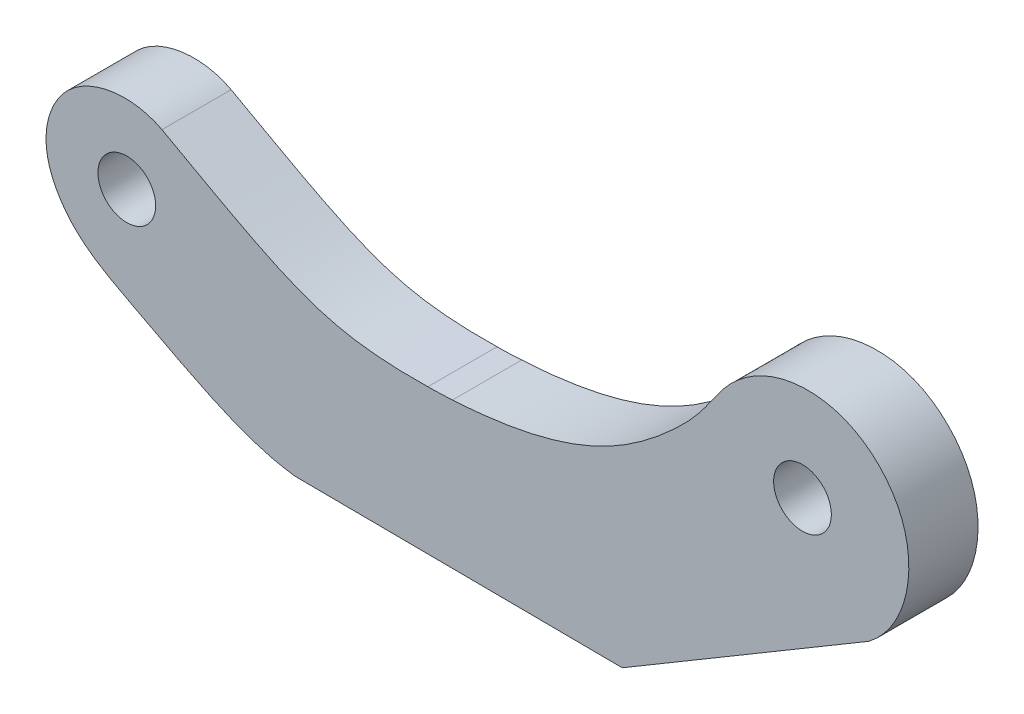
ISO-10303-21;
HEADER;
FILE_DESCRIPTION(('STEP AP214'),'2;1');
FILE_NAME('part.step','',(''),(''),'','','');
FILE_SCHEMA(('AUTOMOTIVE_DESIGN { 1 0 10303 214 1 1 1 1 }'));
ENDSEC;
DATA;
#1=APPLICATION_CONTEXT('core data for automotive mechanical design processes');
#2=APPLICATION_PROTOCOL_DEFINITION('international standard','automotive_design',2000,#1);
#3=PRODUCT_CONTEXT('',#1,'mechanical');
#4=PRODUCT('Part','Part','',(#3));
#5=PRODUCT_RELATED_PRODUCT_CATEGORY('part','',(#4));
#6=PRODUCT_DEFINITION_FORMATION('','',#4);
#7=PRODUCT_DEFINITION_CONTEXT('part definition',#1,'design');
#8=PRODUCT_DEFINITION('design','',#6,#7);
#9=PRODUCT_DEFINITION_SHAPE('','',#8);
#10=(LENGTH_UNIT() NAMED_UNIT(*) SI_UNIT(.MILLI.,.METRE.));
#11=(NAMED_UNIT(*) PLANE_ANGLE_UNIT() SI_UNIT($,.RADIAN.));
#12=(NAMED_UNIT(*) SI_UNIT($,.STERADIAN.) SOLID_ANGLE_UNIT());
#13=UNCERTAINTY_MEASURE_WITH_UNIT(LENGTH_MEASURE(1.E-05),#10,'distance_accuracy_value','');
#14=(GEOMETRIC_REPRESENTATION_CONTEXT(3) GLOBAL_UNCERTAINTY_ASSIGNED_CONTEXT((#13)) GLOBAL_UNIT_ASSIGNED_CONTEXT((#10,
#11,#12)) REPRESENTATION_CONTEXT('',''));
#15=CARTESIAN_POINT('',(0.,0.,0.));
#16=DIRECTION('',(0.,0.,1.));
#17=DIRECTION('',(1.,0.,0.));
#18=AXIS2_PLACEMENT_3D('',#15,#16,#17);
#19=CARTESIAN_POINT('',(-31.2793439312161,18.7531255848201,9.127));
#20=CARTESIAN_POINT('',(-29.0980433454653,20.4036510575763,9.127));
#21=CARTESIAN_POINT('',(-27.9050572559335,25.4416248334502,9.127));
#22=CARTESIAN_POINT('',(-32.3003840528742,29.8584116303143,9.127));
#23=CARTESIAN_POINT('',(-36.6905416729498,29.9188634459079,9.127));
#24=CARTESIAN_POINT('',(-39.6148928825368,27.9423766019697,9.127));
#25=CARTESIAN_POINT('',(-41.0324515703013,25.5521004310688,9.127));
#26=CARTESIAN_POINT('',(-43.2846404569285,23.2416386731387,9.127));
#27=CARTESIAN_POINT('',(-48.1487855967706,19.5714869035757,9.127));
#28=CARTESIAN_POINT('',(-55.4824330057747,18.5532288557096,9.127));
#29=CARTESIAN_POINT('',(-63.127762505071,18.8959739607833,9.127));
#30=CARTESIAN_POINT('',(-68.3011033102577,21.4574379799719,9.127));
#31=CARTESIAN_POINT('',(-72.9856177094147,24.0865685804208,9.127));
#32=CARTESIAN_POINT('',(-76.315266746424,25.8751284241934,9.127));
#33=CARTESIAN_POINT('',(-79.7395264028921,26.2367159767452,9.127));
#34=CARTESIAN_POINT('',(-83.2789287024221,25.7950018133173,9.127));
#35=CARTESIAN_POINT('',(-88.2388176781267,25.8484338999151,9.127));
#36=CARTESIAN_POINT('',(-91.6891719871941,24.9989539466543,9.127));
#37=CARTESIAN_POINT('',(-93.08374484262,23.8512105054544,9.127));
#38=B_SPLINE_CURVE_WITH_KNOTS('',3,(#19,#20,#21,#22,#23,#24,#25,#26,#27,#28,#29,#30,#31,#32,#33,
#34,#35,#36,#37),.UNSPECIFIED.,.F.,.F.,(4,1,1,1,1,1,1,1,1,1,1,1,1,1,1,1,4),(0.,
0.102244465290879,0.160154236261766,0.214292787390952,0.256272844332401,0.289149591331498,
0.319658417070902,0.379342085765607,0.518902230963491,0.590344576338759,0.669858141824343,
0.735080639407954,0.798411315906265,0.81036301693689,0.866325433613108,0.934003558728996,1.),.UNSPECIFIED.);
#39=DIRECTION('',(0.,0.,-1.));
#40=VECTOR('',#39,1.);
#41=SURFACE_OF_LINEAR_EXTRUSION('',#38,#40);
#42=CARTESIAN_POINT('',(-31.2793439312161,18.7531255848201,5.05));
#43=CARTESIAN_POINT('',(-29.0980433454653,20.4036510575763,5.05));
#44=CARTESIAN_POINT('',(-27.9050572559335,25.4416248334502,5.05));
#45=CARTESIAN_POINT('',(-32.3003840528742,29.8584116303143,5.05));
#46=CARTESIAN_POINT('',(-36.6905416729498,29.9188634459079,5.05));
#47=CARTESIAN_POINT('',(-39.6148928825368,27.9423766019697,5.05));
#48=CARTESIAN_POINT('',(-41.0324515703013,25.5521004310688,5.05));
#49=CARTESIAN_POINT('',(-43.2846404569285,23.2416386731387,5.05));
#50=CARTESIAN_POINT('',(-48.1487855967706,19.5714869035757,5.05));
#51=CARTESIAN_POINT('',(-55.4824330057747,18.5532288557096,5.05));
#52=CARTESIAN_POINT('',(-63.127762505071,18.8959739607833,5.05));
#53=CARTESIAN_POINT('',(-68.3011033102577,21.4574379799719,5.05));
#54=CARTESIAN_POINT('',(-72.9856177094147,24.0865685804208,5.05));
#55=CARTESIAN_POINT('',(-76.315266746424,25.8751284241934,5.05));
#56=CARTESIAN_POINT('',(-79.7395264028921,26.2367159767452,5.05));
#57=CARTESIAN_POINT('',(-83.2789287024221,25.7950018133173,5.05));
#58=CARTESIAN_POINT('',(-88.2388176781267,25.8484338999151,5.05));
#59=CARTESIAN_POINT('',(-91.6891719871941,24.9989539466543,5.05));
#60=CARTESIAN_POINT('',(-93.08374484262,23.8512105054544,5.05));
#61=B_SPLINE_CURVE_WITH_KNOTS('',3,(#42,#43,#44,#45,#46,#47,#48,#49,#50,#51,#52,#53,#54,#55,#56,
#57,#58,#59,#60),.UNSPECIFIED.,.F.,.F.,(4,1,1,1,1,1,1,1,1,1,1,1,1,1,1,1,4),(0.,
0.102244465290879,0.160154236261766,0.214292787390952,0.256272844332401,0.289149591331498,
0.319658417070902,0.379342085765607,0.518902230963491,0.590344576338759,0.669858141824343,
0.735080639407954,0.798411315906265,0.81036301693689,0.866325433613108,0.934003558728996,1.),.UNSPECIFIED.);
#62=CARTESIAN_POINT('',(-57.2562652498554,18.7531255848201,5.05));
#63=VERTEX_POINT('',#62);
#64=CARTESIAN_POINT('',(-72.9234112099464,24.0345240039978,5.05));
#65=VERTEX_POINT('',#64);
#66=EDGE_CURVE('E183',#63,#65,#61,.T.);
#67=ORIENTED_EDGE('',*,*,#66,.T.);
#68=DIRECTION('',(0.,0.,-1.));
#69=VECTOR('',#68,1.);
#70=CARTESIAN_POINT('',(-72.9234112099464,24.0345240039978,9.127));
#71=LINE('',#70,#69);
#72=CARTESIAN_POINT('',(-72.9234112099464,24.0345240039978,9.127));
#73=VERTEX_POINT('',#72);
#74=EDGE_CURVE('E11',#73,#65,#71,.T.);
#75=ORIENTED_EDGE('',*,*,#74,.F.);
#76=CARTESIAN_POINT('',(-57.2562652498554,18.7531255848201,9.127));
#77=VERTEX_POINT('',#76);
#78=EDGE_CURVE('E149',#77,#73,#38,.T.);
#79=ORIENTED_EDGE('',*,*,#78,.F.);
#80=DIRECTION('',(0.,0.,-1.));
#81=VECTOR('',#80,1.);
#82=CARTESIAN_POINT('',(-57.2562652498554,18.7531255848201,9.127));
#83=LINE('',#82,#81);
#84=EDGE_CURVE('E117',#77,#63,#83,.T.);
#85=ORIENTED_EDGE('',*,*,#84,.T.);
#86=EDGE_LOOP('',(#67,#75,#79,#85));
#87=FACE_BOUND('',#86,.T.);
#88=ADVANCED_FACE('F36',(#87),#41,.F.);
#89=CARTESIAN_POINT('',(-72.9234110343815,24.0345239075337,9.127));
#90=CARTESIAN_POINT('',(-74.6668385912059,24.9728144011701,9.127));
#91=CARTESIAN_POINT('',(-78.608984564951,24.4332806081771,9.127));
#92=CARTESIAN_POINT('',(-80.3224636066063,19.6609766632408,9.127));
#93=CARTESIAN_POINT('',(-78.2651009405542,16.1277510931857,9.127));
#94=CARTESIAN_POINT('',(-74.7804766187285,14.2670512208381,9.127));
#95=CARTESIAN_POINT('',(-70.5898142586119,12.0499125765865,9.127));
#96=CARTESIAN_POINT('',(-67.2998226179317,10.5540682535027,9.127));
#97=CARTESIAN_POINT('',(-65.0881572359092,10.2736801198191,9.127));
#98=B_SPLINE_CURVE_WITH_KNOTS('',3,(#89,#90,#91,#92,#93,#94,#95,#96,#97),.UNSPECIFIED.,.F.,.F.,
(4,1,1,1,1,1,4),(0.,0.216025249358455,0.338628165965648,0.486312744010124,0.611906589009497,
0.76310073112817,1.),.UNSPECIFIED.);
#99=DIRECTION('',(0.,0.,-1.));
#100=VECTOR('',#99,1.);
#101=SURFACE_OF_LINEAR_EXTRUSION('',#98,#100);
#102=CARTESIAN_POINT('',(-72.9234110343815,24.0345239075337,5.05));
#103=CARTESIAN_POINT('',(-74.6668385912059,24.9728144011701,5.05));
#104=CARTESIAN_POINT('',(-78.608984564951,24.4332806081771,5.05));
#105=CARTESIAN_POINT('',(-80.3224636066063,19.6609766632408,5.05));
#106=CARTESIAN_POINT('',(-78.2651009405542,16.1277510931857,5.05));
#107=CARTESIAN_POINT('',(-74.7804766187285,14.2670512208381,5.05));
#108=CARTESIAN_POINT('',(-70.5898142586119,12.0499125765865,5.05));
#109=CARTESIAN_POINT('',(-67.2998226179317,10.5540682535027,5.05));
#110=CARTESIAN_POINT('',(-65.0881572359092,10.2736801198191,5.05));
#111=B_SPLINE_CURVE_WITH_KNOTS('',3,(#102,#103,#104,#105,#106,#107,#108,#109,#110),
.UNSPECIFIED.,.F.,.F.,(4,1,1,1,1,1,4),(0.,0.216025249358455,0.338628165965648,0.486312744010124,
0.611906589009497,0.76310073112817,1.),.UNSPECIFIED.);
#112=CARTESIAN_POINT('',(-65.0881572359092,10.2736801198191,5.05));
#113=VERTEX_POINT('',#112);
#114=EDGE_CURVE('E181',#65,#113,#111,.T.);
#115=ORIENTED_EDGE('',*,*,#114,.T.);
#116=DIRECTION('',(0.,0.,-1.));
#117=VECTOR('',#116,1.);
#118=CARTESIAN_POINT('',(-65.0881572359092,10.2736801198191,9.127));
#119=LINE('',#118,#117);
#120=CARTESIAN_POINT('',(-65.0881572359092,10.2736801198191,9.127));
#121=VERTEX_POINT('',#120);
#122=EDGE_CURVE('E45',#121,#113,#119,.T.);
#123=ORIENTED_EDGE('',*,*,#122,.F.);
#124=EDGE_CURVE('E90',#73,#121,#98,.T.);
#125=ORIENTED_EDGE('',*,*,#124,.F.);
#126=ORIENTED_EDGE('',*,*,#74,.T.);
#127=EDGE_LOOP('',(#115,#123,#125,#126));
#128=FACE_BOUND('',#127,.T.);
#129=ADVANCED_FACE('F140',(#128),#101,.F.);
#130=CARTESIAN_POINT('',(0.0688111996184571,9.81696790426816,9.127));
#131=DIRECTION('',(0.00700924256241139,0.99997543495763,0.));
#132=DIRECTION('',(-0.99997543495763,0.00700924256241139,0.));
#133=AXIS2_PLACEMENT_3D('',#130,#131,#132);
#134=PLANE('',#133);
#135=DIRECTION('',(0.99997543495763,-0.00700924256241139,0.));
#136=VECTOR('',#135,1.);
#137=CARTESIAN_POINT('',(0.0688111996184571,9.81696790426816,5.05));
#138=LINE('',#137,#136);
#139=CARTESIAN_POINT('',(-45.8065173750898,10.1385271089941,5.05));
#140=VERTEX_POINT('',#139);
#141=EDGE_CURVE('E177',#113,#140,#138,.T.);
#142=ORIENTED_EDGE('',*,*,#141,.T.);
#143=DIRECTION('',(0.,0.,-1.));
#144=VECTOR('',#143,1.);
#145=CARTESIAN_POINT('',(-45.8065173750898,10.1385271089941,9.127));
#146=LINE('',#145,#144);
#147=CARTESIAN_POINT('',(-45.8065173750898,10.1385271089941,9.127));
#148=VERTEX_POINT('',#147);
#149=EDGE_CURVE('E112',#148,#140,#146,.T.);
#150=ORIENTED_EDGE('',*,*,#149,.F.);
#151=DIRECTION('',(0.99997543495763,-0.00700924256241139,0.));
#152=VECTOR('',#151,1.);
#153=CARTESIAN_POINT('',(0.0688111996184571,9.81696790426816,9.127));
#154=LINE('',#153,#152);
#155=EDGE_CURVE('E103',#121,#148,#154,.T.);
#156=ORIENTED_EDGE('',*,*,#155,.F.);
#157=ORIENTED_EDGE('',*,*,#122,.T.);
#158=EDGE_LOOP('',(#142,#150,#156,#157));
#159=FACE_BOUND('',#158,.T.);
#160=ADVANCED_FACE('F137',(#159),#134,.F.);
#161=CARTESIAN_POINT('',(-16.3651324524654,27.597237205665,9.127));
#162=DIRECTION('',(-0.510061044769221,0.860138204365398,0.));
#163=DIRECTION('',(-0.860138204365398,-0.510061044769221,0.));
#164=AXIS2_PLACEMENT_3D('',#161,#162,#163);
#165=PLANE('',#164);
#166=DIRECTION('',(0.860138204365398,0.510061044769221,0.));
#167=VECTOR('',#166,1.);
#168=CARTESIAN_POINT('',(-16.3651324524654,27.597237205665,5.05));
#169=LINE('',#168,#167);
#170=CARTESIAN_POINT('',(-31.2793439312161,18.7531255848201,5.05));
#171=VERTEX_POINT('',#170);
#172=EDGE_CURVE('E111',#140,#171,#169,.T.);
#173=ORIENTED_EDGE('',*,*,#172,.T.);
#174=DIRECTION('',(0.,0.,-1.));
#175=VECTOR('',#174,1.);
#176=CARTESIAN_POINT('',(-31.2793439312161,18.7531255848201,9.127));
#177=LINE('',#176,#175);
#178=CARTESIAN_POINT('',(-31.2793439312161,18.7531255848201,9.127));
#179=VERTEX_POINT('',#178);
#180=EDGE_CURVE('E108',#179,#171,#177,.T.);
#181=ORIENTED_EDGE('',*,*,#180,.F.);
#182=DIRECTION('',(0.860138204365398,0.510061044769221,0.));
#183=VECTOR('',#182,1.);
#184=CARTESIAN_POINT('',(-16.3651324524654,27.597237205665,9.127));
#185=LINE('',#184,#183);
#186=EDGE_CURVE('E97',#148,#179,#185,.T.);
#187=ORIENTED_EDGE('',*,*,#186,.F.);
#188=ORIENTED_EDGE('',*,*,#149,.T.);
#189=EDGE_LOOP('',(#173,#181,#187,#188));
#190=FACE_BOUND('',#189,.T.);
#191=ADVANCED_FACE('F109',(#190),#165,.F.);
#192=CARTESIAN_POINT('',(-31.2793439312161,18.7531255848201,9.127));
#193=CARTESIAN_POINT('',(-29.0980433454653,20.4036510575763,9.127));
#194=CARTESIAN_POINT('',(-27.9050572559335,25.4416248334502,9.127));
#195=CARTESIAN_POINT('',(-32.3003840528742,29.8584116303143,9.127));
#196=CARTESIAN_POINT('',(-36.6905416729498,29.9188634459079,9.127));
#197=CARTESIAN_POINT('',(-39.6148928825368,27.9423766019697,9.127));
#198=CARTESIAN_POINT('',(-41.0324515703013,25.5521004310688,9.127));
#199=CARTESIAN_POINT('',(-43.2846404569285,23.2416386731387,9.127));
#200=CARTESIAN_POINT('',(-48.1487855967706,19.5714869035757,9.127));
#201=CARTESIAN_POINT('',(-55.4824330057747,18.5532288557096,9.127));
#202=CARTESIAN_POINT('',(-63.127762505071,18.8959739607833,9.127));
#203=CARTESIAN_POINT('',(-68.3011033102577,21.4574379799719,9.127));
#204=CARTESIAN_POINT('',(-72.9856177094147,24.0865685804208,9.127));
#205=CARTESIAN_POINT('',(-76.315266746424,25.8751284241934,9.127));
#206=CARTESIAN_POINT('',(-79.7395264028921,26.2367159767452,9.127));
#207=CARTESIAN_POINT('',(-83.2789287024221,25.7950018133173,9.127));
#208=CARTESIAN_POINT('',(-88.2388176781267,25.8484338999151,9.127));
#209=CARTESIAN_POINT('',(-91.6891719871941,24.9989539466543,9.127));
#210=CARTESIAN_POINT('',(-93.08374484262,23.8512105054544,9.127));
#211=B_SPLINE_CURVE_WITH_KNOTS('',3,(#192,#193,#194,#195,#196,#197,#198,#199,#200,#201,#202,
#203,#204,#205,#206,#207,#208,#209,#210),.UNSPECIFIED.,.F.,.F.,(4,1,1,1,1,1,1,1,1,1,1,1,1,1,1,1,
4),(0.,0.102244465290879,0.160154236261766,0.214292787390952,0.256272844332401,
0.289149591331498,0.319658417070902,0.379342085765607,0.518902230963491,0.590344576338759,
0.669858141824343,0.735080639407954,0.798411315906265,0.81036301693689,0.866325433613108,
0.934003558728996,1.),.UNSPECIFIED.);
#212=DIRECTION('',(0.,0.,-1.));
#213=VECTOR('',#212,1.);
#214=SURFACE_OF_LINEAR_EXTRUSION('',#211,#213);
#215=CARTESIAN_POINT('',(-31.2793439312161,18.7531255848201,5.05));
#216=CARTESIAN_POINT('',(-29.0980433454653,20.4036510575763,5.05));
#217=CARTESIAN_POINT('',(-27.9050572559335,25.4416248334502,5.05));
#218=CARTESIAN_POINT('',(-32.3003840528742,29.8584116303143,5.05));
#219=CARTESIAN_POINT('',(-36.6905416729498,29.9188634459079,5.05));
#220=CARTESIAN_POINT('',(-39.6148928825368,27.9423766019697,5.05));
#221=CARTESIAN_POINT('',(-41.0324515703013,25.5521004310688,5.05));
#222=CARTESIAN_POINT('',(-43.2846404569285,23.2416386731387,5.05));
#223=CARTESIAN_POINT('',(-48.1487855967706,19.5714869035757,5.05));
#224=CARTESIAN_POINT('',(-55.4824330057747,18.5532288557096,5.05));
#225=CARTESIAN_POINT('',(-63.127762505071,18.8959739607833,5.05));
#226=CARTESIAN_POINT('',(-68.3011033102577,21.4574379799719,5.05));
#227=CARTESIAN_POINT('',(-72.9856177094147,24.0865685804208,5.05));
#228=CARTESIAN_POINT('',(-76.315266746424,25.8751284241934,5.05));
#229=CARTESIAN_POINT('',(-79.7395264028921,26.2367159767452,5.05));
#230=CARTESIAN_POINT('',(-83.2789287024221,25.7950018133173,5.05));
#231=CARTESIAN_POINT('',(-88.2388176781267,25.8484338999151,5.05));
#232=CARTESIAN_POINT('',(-91.6891719871941,24.9989539466543,5.05));
#233=CARTESIAN_POINT('',(-93.08374484262,23.8512105054544,5.05));
#234=B_SPLINE_CURVE_WITH_KNOTS('',3,(#215,#216,#217,#218,#219,#220,#221,#222,#223,#224,#225,
#226,#227,#228,#229,#230,#231,#232,#233),.UNSPECIFIED.,.F.,.F.,(4,1,1,1,1,1,1,1,1,1,1,1,1,1,1,1,
4),(0.,0.102244465290879,0.160154236261766,0.214292787390952,0.256272844332401,
0.289149591331498,0.319658417070902,0.379342085765607,0.518902230963491,0.590344576338759,
0.669858141824343,0.735080639407954,0.798411315906265,0.81036301693689,0.866325433613108,
0.934003558728996,1.),.UNSPECIFIED.);
#235=CARTESIAN_POINT('',(-55.8031549754556,18.8049533000138,5.05));
#236=VERTEX_POINT('',#235);
#237=EDGE_CURVE('E76',#171,#236,#234,.T.);
#238=ORIENTED_EDGE('',*,*,#237,.T.);
#239=DIRECTION('',(0.,0.,-1.));
#240=VECTOR('',#239,1.);
#241=CARTESIAN_POINT('',(-55.8031549754556,18.8049533000138,9.127));
#242=LINE('',#241,#240);
#243=CARTESIAN_POINT('',(-55.8031549754556,18.8049533000138,9.127));
#244=VERTEX_POINT('',#243);
#245=EDGE_CURVE('E113',#244,#236,#242,.T.);
#246=ORIENTED_EDGE('',*,*,#245,.F.);
#247=EDGE_CURVE('E101',#179,#244,#211,.T.);
#248=ORIENTED_EDGE('',*,*,#247,.F.);
#249=ORIENTED_EDGE('',*,*,#180,.T.);
#250=EDGE_LOOP('',(#238,#246,#248,#249));
#251=FACE_BOUND('',#250,.T.);
#252=ADVANCED_FACE('F115',(#251),#214,.F.);
#253=CARTESIAN_POINT('',(-35.1890677699318,24.1135684786121,9.127));
#254=DIRECTION('',(0.,0.,-1.));
#255=DIRECTION('',(-1.,0.,0.));
#256=AXIS2_PLACEMENT_3D('',#253,#254,#255);
#257=CYLINDRICAL_SURFACE('',#256,1.7);
#258=CARTESIAN_POINT('',(-35.1890677699318,24.1135684786121,9.127));
#259=DIRECTION('',(0.,0.,1.));
#260=DIRECTION('',(1.,0.,0.));
#261=AXIS2_PLACEMENT_3D('',#258,#259,#260);
#262=CIRCLE('',#261,1.7);
#263=CARTESIAN_POINT('',(-33.4890677699318,24.1135684786121,9.127));
#264=VERTEX_POINT('',#263);
#265=EDGE_CURVE('E157',#264,#264,#262,.F.);
#266=ORIENTED_EDGE('',*,*,#265,.F.);
#267=EDGE_LOOP('',(#266));
#268=FACE_BOUND('',#267,.T.);
#269=CARTESIAN_POINT('',(-35.1890677699318,24.1135684786121,5.05));
#270=DIRECTION('',(0.,0.,1.));
#271=DIRECTION('',(1.,0.,0.));
#272=AXIS2_PLACEMENT_3D('',#269,#270,#271);
#273=CIRCLE('',#272,1.7);
#274=CARTESIAN_POINT('',(-33.4890677699318,24.1135684786121,5.05));
#275=VERTEX_POINT('',#274);
#276=EDGE_CURVE('E195',#275,#275,#273,.F.);
#277=ORIENTED_EDGE('',*,*,#276,.T.);
#278=EDGE_LOOP('',(#277));
#279=FACE_BOUND('',#278,.T.);
#280=ADVANCED_FACE('F132',(#268,#279),#257,.F.);
#281=CARTESIAN_POINT('',(-74.9935608009401,19.9565088478769,9.127));
#282=DIRECTION('',(0.,0.,-1.));
#283=DIRECTION('',(-1.,0.,0.));
#284=AXIS2_PLACEMENT_3D('',#281,#282,#283);
#285=CYLINDRICAL_SURFACE('',#284,1.7);
#286=CARTESIAN_POINT('',(-74.9935608009401,19.9565088478769,9.127));
#287=DIRECTION('',(0.,0.,1.));
#288=DIRECTION('',(1.,0.,0.));
#289=AXIS2_PLACEMENT_3D('',#286,#287,#288);
#290=CIRCLE('',#289,1.7);
#291=CARTESIAN_POINT('',(-73.2935608009402,19.9565088478769,9.127));
#292=VERTEX_POINT('',#291);
#293=EDGE_CURVE('E163',#292,#292,#290,.F.);
#294=ORIENTED_EDGE('',*,*,#293,.F.);
#295=EDGE_LOOP('',(#294));
#296=FACE_BOUND('',#295,.T.);
#297=CARTESIAN_POINT('',(-74.9935608009401,19.9565088478769,5.05));
#298=DIRECTION('',(0.,0.,1.));
#299=DIRECTION('',(1.,0.,0.));
#300=AXIS2_PLACEMENT_3D('',#297,#298,#299);
#301=CIRCLE('',#300,1.7);
#302=CARTESIAN_POINT('',(-73.2935608009402,19.9565088478769,5.05));
#303=VERTEX_POINT('',#302);
#304=EDGE_CURVE('E200',#303,#303,#301,.F.);
#305=ORIENTED_EDGE('',*,*,#304,.T.);
#306=EDGE_LOOP('',(#305));
#307=FACE_BOUND('',#306,.T.);
#308=ADVANCED_FACE('F38',(#296,#307),#285,.F.);
#309=CARTESIAN_POINT('',(-57.2562652498555,37.2981255848201,9.127));
#310=DIRECTION('',(0.,0.,-1.));
#311=DIRECTION('',(1.,0.,0.));
#312=AXIS2_PLACEMENT_3D('',#309,#310,#311);
#313=ELLIPSE('',#312,19.45,18.545);
#314=DIRECTION('',(0.,0.,-1.));
#315=VECTOR('',#314,1.);
#316=SURFACE_OF_LINEAR_EXTRUSION('',#313,#315);
#317=CARTESIAN_POINT('',(-57.2562652498555,37.2981255848201,5.05));
#318=DIRECTION('',(0.,0.,-1.));
#319=DIRECTION('',(1.,0.,0.));
#320=AXIS2_PLACEMENT_3D('',#317,#318,#319);
#321=ELLIPSE('',#320,19.45,18.545);
#322=EDGE_CURVE('E82',#236,#63,#321,.T.);
#323=ORIENTED_EDGE('',*,*,#322,.T.);
#324=ORIENTED_EDGE('',*,*,#84,.F.);
#325=EDGE_CURVE('E53',#244,#77,#313,.T.);
#326=ORIENTED_EDGE('',*,*,#325,.F.);
#327=ORIENTED_EDGE('',*,*,#245,.T.);
#328=EDGE_LOOP('',(#323,#324,#326,#327));
#329=FACE_BOUND('',#328,.T.);
#330=ADVANCED_FACE('F133',(#329),#316,.F.);
#331=CARTESIAN_POINT('',(0.,0.,9.127));
#332=DIRECTION('',(0.,0.,1.));
#333=DIRECTION('',(1.,0.,0.));
#334=AXIS2_PLACEMENT_3D('',#331,#332,#333);
#335=PLANE('',#334);
#336=ORIENTED_EDGE('',*,*,#293,.T.);
#337=EDGE_LOOP('',(#336));
#338=FACE_BOUND('',#337,.T.);
#339=ORIENTED_EDGE('',*,*,#265,.T.);
#340=EDGE_LOOP('',(#339));
#341=FACE_BOUND('',#340,.T.);
#342=ORIENTED_EDGE('',*,*,#78,.T.);
#343=ORIENTED_EDGE('',*,*,#124,.T.);
#344=ORIENTED_EDGE('',*,*,#155,.T.);
#345=ORIENTED_EDGE('',*,*,#186,.T.);
#346=ORIENTED_EDGE('',*,*,#247,.T.);
#347=ORIENTED_EDGE('',*,*,#325,.T.);
#348=EDGE_LOOP('',(#342,#343,#344,#345,#346,#347));
#349=FACE_BOUND('',#348,.T.);
#350=ADVANCED_FACE('F99',(#338,#341,#349),#335,.T.);
#351=CARTESIAN_POINT('',(0.,0.,5.05));
#352=DIRECTION('',(0.,0.,1.));
#353=DIRECTION('',(1.,0.,0.));
#354=AXIS2_PLACEMENT_3D('',#351,#352,#353);
#355=PLANE('',#354);
#356=ORIENTED_EDGE('',*,*,#304,.F.);
#357=EDGE_LOOP('',(#356));
#358=FACE_BOUND('',#357,.T.);
#359=ORIENTED_EDGE('',*,*,#276,.F.);
#360=EDGE_LOOP('',(#359));
#361=FACE_BOUND('',#360,.T.);
#362=ORIENTED_EDGE('',*,*,#66,.F.);
#363=ORIENTED_EDGE('',*,*,#322,.F.);
#364=ORIENTED_EDGE('',*,*,#237,.F.);
#365=ORIENTED_EDGE('',*,*,#172,.F.);
#366=ORIENTED_EDGE('',*,*,#141,.F.);
#367=ORIENTED_EDGE('',*,*,#114,.F.);
#368=EDGE_LOOP('',(#362,#363,#364,#365,#366,#367));
#369=FACE_BOUND('',#368,.T.);
#370=ADVANCED_FACE('F180',(#358,#361,#369),#355,.F.);
#371=CLOSED_SHELL('',(#88,#129,#160,#191,#252,#280,#308,#330,#350,#370));
#372=MANIFOLD_SOLID_BREP('B2',#371);
#373=ADVANCED_BREP_SHAPE_REPRESENTATION('',(#18,#372),#14);
#374=SHAPE_DEFINITION_REPRESENTATION(#9,#373);
ENDSEC;
END-ISO-10303-21;
